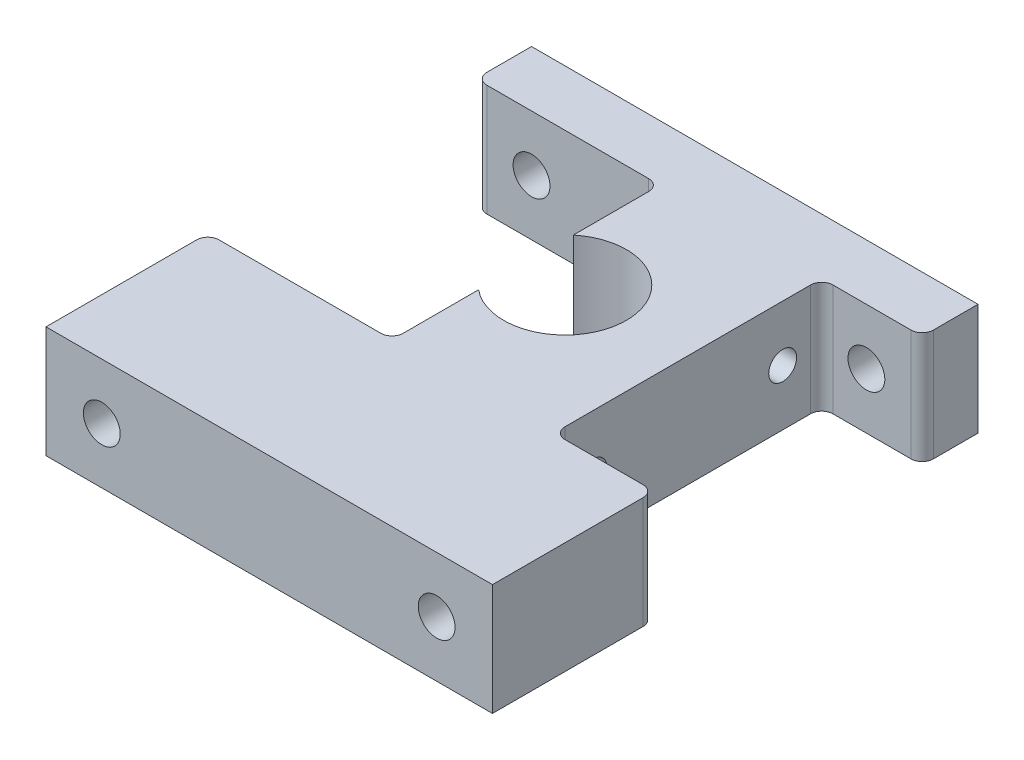
ISO-10303-21;
HEADER;
FILE_DESCRIPTION(('STEP AP214'),'2;1');
FILE_NAME('part.step','',(''),(''),'','','');
FILE_SCHEMA(('AUTOMOTIVE_DESIGN { 1 0 10303 214 1 1 1 1 }'));
ENDSEC;
DATA;
#1=APPLICATION_CONTEXT('core data for automotive mechanical design processes');
#2=APPLICATION_PROTOCOL_DEFINITION('international standard','automotive_design',2000,#1);
#3=PRODUCT_CONTEXT('',#1,'mechanical');
#4=PRODUCT('Part','Part','',(#3));
#5=PRODUCT_RELATED_PRODUCT_CATEGORY('part','',(#4));
#6=PRODUCT_DEFINITION_FORMATION('','',#4);
#7=PRODUCT_DEFINITION_CONTEXT('part definition',#1,'design');
#8=PRODUCT_DEFINITION('design','',#6,#7);
#9=PRODUCT_DEFINITION_SHAPE('','',#8);
#10=(LENGTH_UNIT() NAMED_UNIT(*) SI_UNIT(.MILLI.,.METRE.));
#11=(NAMED_UNIT(*) PLANE_ANGLE_UNIT() SI_UNIT($,.RADIAN.));
#12=(NAMED_UNIT(*) SI_UNIT($,.STERADIAN.) SOLID_ANGLE_UNIT());
#13=UNCERTAINTY_MEASURE_WITH_UNIT(LENGTH_MEASURE(1.E-05),#10,'distance_accuracy_value','');
#14=(GEOMETRIC_REPRESENTATION_CONTEXT(3) GLOBAL_UNCERTAINTY_ASSIGNED_CONTEXT((#13)) GLOBAL_UNIT_ASSIGNED_CONTEXT((#10,
#11,#12)) REPRESENTATION_CONTEXT('',''));
#15=CARTESIAN_POINT('',(0.,0.,0.));
#16=DIRECTION('',(0.,0.,1.));
#17=DIRECTION('',(1.,0.,0.));
#18=AXIS2_PLACEMENT_3D('',#15,#16,#17);
#19=CARTESIAN_POINT('',(20.,10.,17.));
#20=DIRECTION('',(-1.,0.,0.));
#21=DIRECTION('',(0.,0.,1.));
#22=AXIS2_PLACEMENT_3D('',#19,#20,#21);
#23=PLANE('',#22);
#24=DIRECTION('',(0.,0.,-1.));
#25=VECTOR('',#24,1.);
#26=CARTESIAN_POINT('',(20.,10.,17.));
#27=LINE('',#26,#25);
#28=CARTESIAN_POINT('',(20.,10.,-12.9999999999999));
#29=VERTEX_POINT('',#28);
#30=CARTESIAN_POINT('',(20.,10.,-17.));
#31=VERTEX_POINT('',#30);
#32=EDGE_CURVE('E209',#29,#31,#27,.T.);
#33=ORIENTED_EDGE('',*,*,#32,.F.);
#34=DIRECTION('',(0.,-1.,0.));
#35=VECTOR('',#34,1.);
#36=CARTESIAN_POINT('',(20.,10.,-12.9999999999999));
#37=LINE('',#36,#35);
#38=CARTESIAN_POINT('',(20.,0.,-12.9999999999999));
#39=VERTEX_POINT('',#38);
#40=EDGE_CURVE('E57',#29,#39,#37,.T.);
#41=ORIENTED_EDGE('',*,*,#40,.T.);
#42=DIRECTION('',(0.,0.,-1.));
#43=VECTOR('',#42,1.);
#44=CARTESIAN_POINT('',(20.,0.,17.));
#45=LINE('',#44,#43);
#46=CARTESIAN_POINT('',(20.,0.,-17.));
#47=VERTEX_POINT('',#46);
#48=EDGE_CURVE('E358',#39,#47,#45,.T.);
#49=ORIENTED_EDGE('',*,*,#48,.T.);
#50=DIRECTION('',(0.,-1.,0.));
#51=VECTOR('',#50,1.);
#52=CARTESIAN_POINT('',(20.,10.,-17.));
#53=LINE('',#52,#51);
#54=EDGE_CURVE('E382',#31,#47,#53,.T.);
#55=ORIENTED_EDGE('',*,*,#54,.F.);
#56=EDGE_LOOP('',(#33,#41,#49,#55));
#57=FACE_BOUND('',#56,.T.);
#58=ADVANCED_FACE('F47',(#57),#23,.F.);
#59=CARTESIAN_POINT('',(-20.,10.,17.));
#60=DIRECTION('',(1.,0.,0.));
#61=DIRECTION('',(0.,0.,-1.));
#62=AXIS2_PLACEMENT_3D('',#59,#60,#61);
#63=PLANE('',#62);
#64=DIRECTION('',(0.,0.,1.));
#65=VECTOR('',#64,1.);
#66=CARTESIAN_POINT('',(-20.,10.,17.));
#67=LINE('',#66,#65);
#68=CARTESIAN_POINT('',(-20.,10.,13.));
#69=VERTEX_POINT('',#68);
#70=CARTESIAN_POINT('',(-20.,10.,26.5));
#71=VERTEX_POINT('',#70);
#72=EDGE_CURVE('E224',#69,#71,#67,.T.);
#73=ORIENTED_EDGE('',*,*,#72,.F.);
#74=DIRECTION('',(0.,-1.,0.));
#75=VECTOR('',#74,1.);
#76=CARTESIAN_POINT('',(-20.,10.,13.));
#77=LINE('',#76,#75);
#78=CARTESIAN_POINT('',(-20.,0.,13.));
#79=VERTEX_POINT('',#78);
#80=EDGE_CURVE('E392',#69,#79,#77,.T.);
#81=ORIENTED_EDGE('',*,*,#80,.T.);
#82=DIRECTION('',(0.,0.,1.));
#83=VECTOR('',#82,1.);
#84=CARTESIAN_POINT('',(-20.,0.,17.));
#85=LINE('',#84,#83);
#86=CARTESIAN_POINT('',(-20.,0.,26.5));
#87=VERTEX_POINT('',#86);
#88=EDGE_CURVE('E374',#79,#87,#85,.T.);
#89=ORIENTED_EDGE('',*,*,#88,.T.);
#90=DIRECTION('',(0.,-1.,0.));
#91=VECTOR('',#90,1.);
#92=CARTESIAN_POINT('',(-20.,10.,26.5));
#93=LINE('',#92,#91);
#94=EDGE_CURVE('E219',#71,#87,#93,.T.);
#95=ORIENTED_EDGE('',*,*,#94,.F.);
#96=EDGE_LOOP('',(#73,#81,#89,#95));
#97=FACE_BOUND('',#96,.T.);
#98=ADVANCED_FACE('F615',(#97),#63,.F.);
#99=CARTESIAN_POINT('',(0.,10.,0.));
#100=DIRECTION('',(0.,-1.,0.));
#101=DIRECTION('',(0.,0.,-1.));
#102=AXIS2_PLACEMENT_3D('',#99,#100,#101);
#103=PLANE('',#102);
#104=DIRECTION('',(-1.,0.,0.));
#105=VECTOR('',#104,1.);
#106=CARTESIAN_POINT('',(-36.5,10.,12.));
#107=LINE('',#106,#105);
#108=CARTESIAN_POINT('',(-4.5,10.,12.));
#109=VERTEX_POINT('',#108);
#110=CARTESIAN_POINT('',(-19.,10.,12.));
#111=VERTEX_POINT('',#110);
#112=EDGE_CURVE('E268',#109,#111,#107,.T.);
#113=ORIENTED_EDGE('',*,*,#112,.T.);
#114=CARTESIAN_POINT('',(-19.,10.,13.));
#115=DIRECTION('',(0.,-1.,0.));
#116=DIRECTION('',(0.,0.,-1.));
#117=AXIS2_PLACEMENT_3D('',#114,#115,#116);
#118=CIRCLE('',#117,1.);
#119=EDGE_CURVE('E419',#111,#69,#118,.F.);
#120=ORIENTED_EDGE('',*,*,#119,.T.);
#121=ORIENTED_EDGE('',*,*,#72,.T.);
#122=DIRECTION('',(-1.,0.,0.));
#123=VECTOR('',#122,1.);
#124=CARTESIAN_POINT('',(-20.,10.,26.5));
#125=LINE('',#124,#123);
#126=CARTESIAN_POINT('',(20.,10.,26.5));
#127=VERTEX_POINT('',#126);
#128=EDGE_CURVE('E215',#127,#71,#125,.T.);
#129=ORIENTED_EDGE('',*,*,#128,.F.);
#130=CARTESIAN_POINT('',(20.,10.,13.));
#131=VERTEX_POINT('',#130);
#132=EDGE_CURVE('E198',#127,#131,#27,.T.);
#133=ORIENTED_EDGE('',*,*,#132,.T.);
#134=CARTESIAN_POINT('',(19.,10.,13.));
#135=DIRECTION('',(0.,-1.,0.));
#136=DIRECTION('',(0.,0.,-1.));
#137=AXIS2_PLACEMENT_3D('',#134,#135,#136);
#138=CIRCLE('',#137,1.);
#139=CARTESIAN_POINT('',(19.,10.,12.));
#140=VERTEX_POINT('',#139);
#141=EDGE_CURVE('E414',#131,#140,#138,.F.);
#142=ORIENTED_EDGE('',*,*,#141,.T.);
#143=DIRECTION('',(-1.,0.,0.));
#144=VECTOR('',#143,1.);
#145=CARTESIAN_POINT('',(12.,10.,12.));
#146=LINE('',#145,#144);
#147=CARTESIAN_POINT('',(12.,10.,12.));
#148=VERTEX_POINT('',#147);
#149=EDGE_CURVE('E305',#140,#148,#146,.T.);
#150=ORIENTED_EDGE('',*,*,#149,.T.);
#151=CARTESIAN_POINT('',(12.,10.,11.));
#152=DIRECTION('',(0.,-1.,0.));
#153=DIRECTION('',(0.,0.,1.));
#154=AXIS2_PLACEMENT_3D('',#151,#152,#153);
#155=CIRCLE('',#154,1.);
#156=CARTESIAN_POINT('',(11.,10.,11.));
#157=VERTEX_POINT('',#156);
#158=EDGE_CURVE('E308',#148,#157,#155,.T.);
#159=ORIENTED_EDGE('',*,*,#158,.T.);
#160=DIRECTION('',(0.,0.,-1.));
#161=VECTOR('',#160,1.);
#162=CARTESIAN_POINT('',(11.,10.,-10.9999999999999));
#163=LINE('',#162,#161);
#164=CARTESIAN_POINT('',(11.,10.,-10.9999999999999));
#165=VERTEX_POINT('',#164);
#166=EDGE_CURVE('E313',#157,#165,#163,.T.);
#167=ORIENTED_EDGE('',*,*,#166,.T.);
#168=CARTESIAN_POINT('',(12.,10.,-10.9999999999999));
#169=DIRECTION('',(0.,-1.,0.));
#170=DIRECTION('',(0.,0.,1.));
#171=AXIS2_PLACEMENT_3D('',#168,#169,#170);
#172=CIRCLE('',#171,0.999999999999999);
#173=CARTESIAN_POINT('',(12.,10.,-11.9999999999999));
#174=VERTEX_POINT('',#173);
#175=EDGE_CURVE('E317',#165,#174,#172,.T.);
#176=ORIENTED_EDGE('',*,*,#175,.T.);
#177=DIRECTION('',(1.,0.,0.));
#178=VECTOR('',#177,1.);
#179=CARTESIAN_POINT('',(12.,10.,-11.9999999999999));
#180=LINE('',#179,#178);
#181=CARTESIAN_POINT('',(19.,10.,-11.9999999999999));
#182=VERTEX_POINT('',#181);
#183=EDGE_CURVE('E321',#174,#182,#180,.T.);
#184=ORIENTED_EDGE('',*,*,#183,.T.);
#185=CARTESIAN_POINT('',(19.,10.,-12.9999999999999));
#186=DIRECTION('',(0.,-1.,0.));
#187=DIRECTION('',(0.,0.,-1.));
#188=AXIS2_PLACEMENT_3D('',#185,#186,#187);
#189=CIRCLE('',#188,1.);
#190=EDGE_CURVE('E411',#182,#29,#189,.F.);
#191=ORIENTED_EDGE('',*,*,#190,.T.);
#192=ORIENTED_EDGE('',*,*,#32,.T.);
#193=DIRECTION('',(-1.,0.,0.));
#194=VECTOR('',#193,1.);
#195=CARTESIAN_POINT('',(-20.,10.,-17.));
#196=LINE('',#195,#194);
#197=CARTESIAN_POINT('',(-20.,10.,-17.));
#198=VERTEX_POINT('',#197);
#199=EDGE_CURVE('E208',#31,#198,#196,.T.);
#200=ORIENTED_EDGE('',*,*,#199,.T.);
#201=CARTESIAN_POINT('',(-20.,10.,-13.));
#202=VERTEX_POINT('',#201);
#203=EDGE_CURVE('E364',#198,#202,#67,.T.);
#204=ORIENTED_EDGE('',*,*,#203,.T.);
#205=CARTESIAN_POINT('',(-19.,10.,-13.));
#206=DIRECTION('',(0.,-1.,0.));
#207=DIRECTION('',(0.,0.,-1.));
#208=AXIS2_PLACEMENT_3D('',#205,#206,#207);
#209=CIRCLE('',#208,1.);
#210=CARTESIAN_POINT('',(-19.,10.,-12.));
#211=VERTEX_POINT('',#210);
#212=EDGE_CURVE('E64',#202,#211,#209,.F.);
#213=ORIENTED_EDGE('',*,*,#212,.T.);
#214=DIRECTION('',(1.,0.,0.));
#215=VECTOR('',#214,1.);
#216=CARTESIAN_POINT('',(-36.5,10.,-12.));
#217=LINE('',#216,#215);
#218=CARTESIAN_POINT('',(-4.5,10.,-12.));
#219=VERTEX_POINT('',#218);
#220=EDGE_CURVE('E251',#211,#219,#217,.T.);
#221=ORIENTED_EDGE('',*,*,#220,.T.);
#222=CARTESIAN_POINT('',(-4.5,10.,-11.));
#223=DIRECTION('',(0.,-1.,0.));
#224=DIRECTION('',(0.,0.,-1.));
#225=AXIS2_PLACEMENT_3D('',#222,#223,#224);
#226=CIRCLE('',#225,1.);
#227=CARTESIAN_POINT('',(-3.5,10.,-11.));
#228=VERTEX_POINT('',#227);
#229=EDGE_CURVE('E254',#219,#228,#226,.T.);
#230=ORIENTED_EDGE('',*,*,#229,.T.);
#231=DIRECTION('',(0.,0.,1.));
#232=VECTOR('',#231,1.);
#233=CARTESIAN_POINT('',(-3.5,10.,-11.));
#234=LINE('',#233,#232);
#235=CARTESIAN_POINT('',(-3.5,10.,-4.24264068711928));
#236=VERTEX_POINT('',#235);
#237=EDGE_CURVE('E260',#228,#236,#234,.T.);
#238=ORIENTED_EDGE('',*,*,#237,.T.);
#239=CARTESIAN_POINT('',(0.,10.,0.));
#240=DIRECTION('',(0.,1.,0.));
#241=DIRECTION('',(0.,0.,1.));
#242=AXIS2_PLACEMENT_3D('',#239,#240,#241);
#243=CIRCLE('',#242,5.5);
#244=CARTESIAN_POINT('',(-3.5,10.,4.24264068711928));
#245=VERTEX_POINT('',#244);
#246=EDGE_CURVE('E354',#245,#236,#243,.T.);
#247=ORIENTED_EDGE('',*,*,#246,.F.);
#248=CARTESIAN_POINT('',(-3.5,10.,11.));
#249=VERTEX_POINT('',#248);
#250=EDGE_CURVE('E259',#245,#249,#234,.T.);
#251=ORIENTED_EDGE('',*,*,#250,.T.);
#252=CARTESIAN_POINT('',(-4.5,10.,11.));
#253=DIRECTION('',(0.,-1.,0.));
#254=DIRECTION('',(0.,0.,1.));
#255=AXIS2_PLACEMENT_3D('',#252,#253,#254);
#256=CIRCLE('',#255,1.);
#257=EDGE_CURVE('E264',#249,#109,#256,.T.);
#258=ORIENTED_EDGE('',*,*,#257,.T.);
#259=EDGE_LOOP('',(#113,#120,#121,#129,#133,#142,#150,#159,#167,#176,#184,#191,#192,#200,#204,
#213,#221,#230,#238,#247,#251,#258));
#260=FACE_BOUND('',#259,.T.);
#261=ADVANCED_FACE('F222',(#260),#103,.F.);
#262=CARTESIAN_POINT('',(0.,0.,0.));
#263=DIRECTION('',(0.,-1.,0.));
#264=DIRECTION('',(0.,0.,-1.));
#265=AXIS2_PLACEMENT_3D('',#262,#263,#264);
#266=PLANE('',#265);
#267=ORIENTED_EDGE('',*,*,#88,.F.);
#268=CARTESIAN_POINT('',(-19.,0.,13.));
#269=DIRECTION('',(0.,-1.,0.));
#270=DIRECTION('',(0.,0.,-1.));
#271=AXIS2_PLACEMENT_3D('',#268,#269,#270);
#272=CIRCLE('',#271,1.);
#273=CARTESIAN_POINT('',(-19.,0.,12.));
#274=VERTEX_POINT('',#273);
#275=EDGE_CURVE('E405',#79,#274,#272,.T.);
#276=ORIENTED_EDGE('',*,*,#275,.T.);
#277=DIRECTION('',(-1.,0.,0.));
#278=VECTOR('',#277,1.);
#279=CARTESIAN_POINT('',(-36.5,0.,12.));
#280=LINE('',#279,#278);
#281=CARTESIAN_POINT('',(-4.5,0.,12.));
#282=VERTEX_POINT('',#281);
#283=EDGE_CURVE('E255',#282,#274,#280,.T.);
#284=ORIENTED_EDGE('',*,*,#283,.F.);
#285=CARTESIAN_POINT('',(-4.5,0.,11.));
#286=DIRECTION('',(0.,-1.,0.));
#287=DIRECTION('',(0.,0.,1.));
#288=AXIS2_PLACEMENT_3D('',#285,#286,#287);
#289=CIRCLE('',#288,1.);
#290=CARTESIAN_POINT('',(-3.5,0.,11.));
#291=VERTEX_POINT('',#290);
#292=EDGE_CURVE('E284',#291,#282,#289,.T.);
#293=ORIENTED_EDGE('',*,*,#292,.F.);
#294=DIRECTION('',(0.,0.,1.));
#295=VECTOR('',#294,1.);
#296=CARTESIAN_POINT('',(-3.5,0.,-11.));
#297=LINE('',#296,#295);
#298=CARTESIAN_POINT('',(-3.5,0.,4.24264068711928));
#299=VERTEX_POINT('',#298);
#300=EDGE_CURVE('E280',#299,#291,#297,.T.);
#301=ORIENTED_EDGE('',*,*,#300,.F.);
#302=CARTESIAN_POINT('',(0.,0.,0.));
#303=DIRECTION('',(0.,1.,0.));
#304=DIRECTION('',(0.,0.,1.));
#305=AXIS2_PLACEMENT_3D('',#302,#303,#304);
#306=CIRCLE('',#305,5.5);
#307=CARTESIAN_POINT('',(-3.5,0.,-4.24264068711928));
#308=VERTEX_POINT('',#307);
#309=EDGE_CURVE('E294',#299,#308,#306,.T.);
#310=ORIENTED_EDGE('',*,*,#309,.T.);
#311=CARTESIAN_POINT('',(-3.5,0.,-11.));
#312=VERTEX_POINT('',#311);
#313=EDGE_CURVE('E281',#312,#308,#297,.T.);
#314=ORIENTED_EDGE('',*,*,#313,.F.);
#315=CARTESIAN_POINT('',(-4.5,0.,-11.));
#316=DIRECTION('',(0.,-1.,0.));
#317=DIRECTION('',(0.,0.,-1.));
#318=AXIS2_PLACEMENT_3D('',#315,#316,#317);
#319=CIRCLE('',#318,1.);
#320=CARTESIAN_POINT('',(-4.5,0.,-12.));
#321=VERTEX_POINT('',#320);
#322=EDGE_CURVE('E275',#321,#312,#319,.T.);
#323=ORIENTED_EDGE('',*,*,#322,.F.);
#324=DIRECTION('',(1.,0.,0.));
#325=VECTOR('',#324,1.);
#326=CARTESIAN_POINT('',(-36.5,0.,-12.));
#327=LINE('',#326,#325);
#328=CARTESIAN_POINT('',(-19.,0.,-12.));
#329=VERTEX_POINT('',#328);
#330=EDGE_CURVE('E272',#329,#321,#327,.T.);
#331=ORIENTED_EDGE('',*,*,#330,.F.);
#332=CARTESIAN_POINT('',(-19.,0.,-13.));
#333=DIRECTION('',(0.,-1.,0.));
#334=DIRECTION('',(0.,0.,-1.));
#335=AXIS2_PLACEMENT_3D('',#332,#333,#334);
#336=CIRCLE('',#335,1.);
#337=CARTESIAN_POINT('',(-20.,0.,-13.));
#338=VERTEX_POINT('',#337);
#339=EDGE_CURVE('E402',#329,#338,#336,.T.);
#340=ORIENTED_EDGE('',*,*,#339,.T.);
#341=CARTESIAN_POINT('',(-20.,0.,-17.));
#342=VERTEX_POINT('',#341);
#343=EDGE_CURVE('E375',#342,#338,#85,.T.);
#344=ORIENTED_EDGE('',*,*,#343,.F.);
#345=DIRECTION('',(-1.,0.,0.));
#346=VECTOR('',#345,1.);
#347=CARTESIAN_POINT('',(-20.,0.,-17.));
#348=LINE('',#347,#346);
#349=EDGE_CURVE('E371',#47,#342,#348,.T.);
#350=ORIENTED_EDGE('',*,*,#349,.F.);
#351=ORIENTED_EDGE('',*,*,#48,.F.);
#352=CARTESIAN_POINT('',(19.,0.,-12.9999999999999));
#353=DIRECTION('',(0.,-1.,0.));
#354=DIRECTION('',(0.,0.,-1.));
#355=AXIS2_PLACEMENT_3D('',#352,#353,#354);
#356=CIRCLE('',#355,1.);
#357=CARTESIAN_POINT('',(19.,0.,-11.9999999999999));
#358=VERTEX_POINT('',#357);
#359=EDGE_CURVE('E396',#39,#358,#356,.T.);
#360=ORIENTED_EDGE('',*,*,#359,.T.);
#361=DIRECTION('',(1.,0.,0.));
#362=VECTOR('',#361,1.);
#363=CARTESIAN_POINT('',(12.,0.,-11.9999999999999));
#364=LINE('',#363,#362);
#365=CARTESIAN_POINT('',(12.,0.,-11.9999999999999));
#366=VERTEX_POINT('',#365);
#367=EDGE_CURVE('E309',#366,#358,#364,.T.);
#368=ORIENTED_EDGE('',*,*,#367,.F.);
#369=CARTESIAN_POINT('',(12.,0.,-10.9999999999999));
#370=DIRECTION('',(0.,-1.,0.));
#371=DIRECTION('',(0.,0.,1.));
#372=AXIS2_PLACEMENT_3D('',#369,#370,#371);
#373=CIRCLE('',#372,0.999999999999999);
#374=CARTESIAN_POINT('',(11.,0.,-10.9999999999999));
#375=VERTEX_POINT('',#374);
#376=EDGE_CURVE('E336',#375,#366,#373,.T.);
#377=ORIENTED_EDGE('',*,*,#376,.F.);
#378=DIRECTION('',(0.,0.,-1.));
#379=VECTOR('',#378,1.);
#380=CARTESIAN_POINT('',(11.,0.,-10.9999999999999));
#381=LINE('',#380,#379);
#382=CARTESIAN_POINT('',(11.,0.,11.));
#383=VERTEX_POINT('',#382);
#384=EDGE_CURVE('E332',#383,#375,#381,.T.);
#385=ORIENTED_EDGE('',*,*,#384,.F.);
#386=CARTESIAN_POINT('',(12.,0.,11.));
#387=DIRECTION('',(0.,-1.,0.));
#388=DIRECTION('',(0.,0.,1.));
#389=AXIS2_PLACEMENT_3D('',#386,#387,#388);
#390=CIRCLE('',#389,1.);
#391=CARTESIAN_POINT('',(12.,0.,12.));
#392=VERTEX_POINT('',#391);
#393=EDGE_CURVE('E328',#392,#383,#390,.T.);
#394=ORIENTED_EDGE('',*,*,#393,.F.);
#395=DIRECTION('',(-1.,0.,0.));
#396=VECTOR('',#395,1.);
#397=CARTESIAN_POINT('',(12.,0.,12.));
#398=LINE('',#397,#396);
#399=CARTESIAN_POINT('',(19.,0.,12.));
#400=VERTEX_POINT('',#399);
#401=EDGE_CURVE('E250',#400,#392,#398,.T.);
#402=ORIENTED_EDGE('',*,*,#401,.F.);
#403=CARTESIAN_POINT('',(19.,0.,13.));
#404=DIRECTION('',(0.,-1.,0.));
#405=DIRECTION('',(0.,0.,-1.));
#406=AXIS2_PLACEMENT_3D('',#403,#404,#405);
#407=CIRCLE('',#406,1.);
#408=CARTESIAN_POINT('',(20.,0.,13.));
#409=VERTEX_POINT('',#408);
#410=EDGE_CURVE('E399',#400,#409,#407,.T.);
#411=ORIENTED_EDGE('',*,*,#410,.T.);
#412=CARTESIAN_POINT('',(20.,0.,26.5));
#413=VERTEX_POINT('',#412);
#414=EDGE_CURVE('E368',#413,#409,#45,.T.);
#415=ORIENTED_EDGE('',*,*,#414,.F.);
#416=DIRECTION('',(-1.,0.,0.));
#417=VECTOR('',#416,1.);
#418=CARTESIAN_POINT('',(-20.,0.,26.5));
#419=LINE('',#418,#417);
#420=EDGE_CURVE('E217',#413,#87,#419,.T.);
#421=ORIENTED_EDGE('',*,*,#420,.T.);
#422=EDGE_LOOP('',(#267,#276,#284,#293,#301,#310,#314,#323,#331,#340,#344,#350,#351,#360,#368,
#377,#385,#394,#402,#411,#415,#421));
#423=FACE_BOUND('',#422,.T.);
#424=ADVANCED_FACE('F447',(#423),#266,.T.);
#425=ORIENTED_EDGE('',*,*,#414,.T.);
#426=DIRECTION('',(0.,1.,0.));
#427=VECTOR('',#426,1.);
#428=CARTESIAN_POINT('',(20.,10.,13.));
#429=LINE('',#428,#427);
#430=EDGE_CURVE('E205',#409,#131,#429,.T.);
#431=ORIENTED_EDGE('',*,*,#430,.T.);
#432=ORIENTED_EDGE('',*,*,#132,.F.);
#433=DIRECTION('',(0.,-1.,0.));
#434=VECTOR('',#433,1.);
#435=CARTESIAN_POINT('',(20.,10.,26.5));
#436=LINE('',#435,#434);
#437=EDGE_CURVE('E202',#127,#413,#436,.T.);
#438=ORIENTED_EDGE('',*,*,#437,.T.);
#439=EDGE_LOOP('',(#425,#431,#432,#438));
#440=FACE_BOUND('',#439,.T.);
#441=ADVANCED_FACE('F201',(#440),#23,.F.);
#442=CARTESIAN_POINT('',(-20.,10.,-17.));
#443=DIRECTION('',(0.,0.,1.));
#444=DIRECTION('',(1.,0.,0.));
#445=AXIS2_PLACEMENT_3D('',#442,#443,#444);
#446=PLANE('',#445);
#447=CARTESIAN_POINT('',(15.,5.,-17.));
#448=DIRECTION('',(0.,0.,-1.));
#449=DIRECTION('',(-1.,0.,0.));
#450=AXIS2_PLACEMENT_3D('',#447,#448,#449);
#451=CIRCLE('',#450,1.64999999999999);
#452=CARTESIAN_POINT('',(13.35,5.,-17.));
#453=VERTEX_POINT('',#452);
#454=EDGE_CURVE('E576',#453,#453,#451,.T.);
#455=ORIENTED_EDGE('',*,*,#454,.F.);
#456=EDGE_LOOP('',(#455));
#457=FACE_BOUND('',#456,.T.);
#458=CARTESIAN_POINT('',(-15.,5.,-17.));
#459=DIRECTION('',(0.,0.,-1.));
#460=DIRECTION('',(-1.,0.,0.));
#461=AXIS2_PLACEMENT_3D('',#458,#459,#460);
#462=CIRCLE('',#461,1.64999999999999);
#463=CARTESIAN_POINT('',(-16.65,5.,-17.));
#464=VERTEX_POINT('',#463);
#465=EDGE_CURVE('E564',#464,#464,#462,.T.);
#466=ORIENTED_EDGE('',*,*,#465,.F.);
#467=EDGE_LOOP('',(#466));
#468=FACE_BOUND('',#467,.T.);
#469=ORIENTED_EDGE('',*,*,#349,.T.);
#470=DIRECTION('',(0.,-1.,0.));
#471=VECTOR('',#470,1.);
#472=CARTESIAN_POINT('',(-20.,10.,-17.));
#473=LINE('',#472,#471);
#474=EDGE_CURVE('E367',#198,#342,#473,.T.);
#475=ORIENTED_EDGE('',*,*,#474,.F.);
#476=ORIENTED_EDGE('',*,*,#199,.F.);
#477=ORIENTED_EDGE('',*,*,#54,.T.);
#478=EDGE_LOOP('',(#469,#475,#476,#477));
#479=FACE_BOUND('',#478,.T.);
#480=ADVANCED_FACE('F587',(#457,#468,#479),#446,.F.);
#481=ORIENTED_EDGE('',*,*,#343,.T.);
#482=DIRECTION('',(0.,1.,0.));
#483=VECTOR('',#482,1.);
#484=CARTESIAN_POINT('',(-20.,10.,-13.));
#485=LINE('',#484,#483);
#486=EDGE_CURVE('E422',#338,#202,#485,.T.);
#487=ORIENTED_EDGE('',*,*,#486,.T.);
#488=ORIENTED_EDGE('',*,*,#203,.F.);
#489=ORIENTED_EDGE('',*,*,#474,.T.);
#490=EDGE_LOOP('',(#481,#487,#488,#489));
#491=FACE_BOUND('',#490,.T.);
#492=ADVANCED_FACE('F590',(#491),#63,.F.);
#493=CARTESIAN_POINT('',(0.,10.,0.));
#494=DIRECTION('',(0.,-1.,0.));
#495=DIRECTION('',(0.,0.,-1.));
#496=AXIS2_PLACEMENT_3D('',#493,#494,#495);
#497=CYLINDRICAL_SURFACE('',#496,5.5);
#498=DIRECTION('',(0.,-1.,0.));
#499=VECTOR('',#498,1.);
#500=CARTESIAN_POINT('',(-3.5,10.,4.24264068711928));
#501=LINE('',#500,#499);
#502=EDGE_CURVE('E389',#245,#299,#501,.T.);
#503=ORIENTED_EDGE('',*,*,#502,.F.);
#504=ORIENTED_EDGE('',*,*,#246,.T.);
#505=DIRECTION('',(0.,-1.,0.));
#506=VECTOR('',#505,1.);
#507=CARTESIAN_POINT('',(-3.5,10.,-4.24264068711928));
#508=LINE('',#507,#506);
#509=EDGE_CURVE('E386',#308,#236,#508,.F.);
#510=ORIENTED_EDGE('',*,*,#509,.F.);
#511=ORIENTED_EDGE('',*,*,#309,.F.);
#512=EDGE_LOOP('',(#503,#504,#510,#511));
#513=FACE_BOUND('',#512,.T.);
#514=ADVANCED_FACE('F669',(#513),#497,.F.);
#515=CARTESIAN_POINT('',(-3.5,10.,-11.));
#516=DIRECTION('',(1.,0.,0.));
#517=DIRECTION('',(0.,0.,-1.));
#518=AXIS2_PLACEMENT_3D('',#515,#516,#517);
#519=PLANE('',#518);
#520=CARTESIAN_POINT('',(-3.5,5.,-8.5));
#521=DIRECTION('',(-1.,0.,0.));
#522=DIRECTION('',(0.,0.,1.));
#523=AXIS2_PLACEMENT_3D('',#520,#521,#522);
#524=CIRCLE('',#523,1.24999999999999);
#525=CARTESIAN_POINT('',(-3.5,5.,-7.25000000000002));
#526=VERTEX_POINT('',#525);
#527=EDGE_CURVE('E237',#526,#526,#524,.T.);
#528=ORIENTED_EDGE('',*,*,#527,.F.);
#529=EDGE_LOOP('',(#528));
#530=FACE_BOUND('',#529,.T.);
#531=ORIENTED_EDGE('',*,*,#509,.T.);
#532=ORIENTED_EDGE('',*,*,#237,.F.);
#533=DIRECTION('',(0.,-1.,0.));
#534=VECTOR('',#533,1.);
#535=CARTESIAN_POINT('',(-3.5,10.,-11.));
#536=LINE('',#535,#534);
#537=EDGE_CURVE('E299',#228,#312,#536,.T.);
#538=ORIENTED_EDGE('',*,*,#537,.T.);
#539=ORIENTED_EDGE('',*,*,#313,.T.);
#540=EDGE_LOOP('',(#531,#532,#538,#539));
#541=FACE_BOUND('',#540,.T.);
#542=ADVANCED_FACE('F673',(#530,#541),#519,.F.);
#543=CARTESIAN_POINT('',(-36.5,10.,-12.));
#544=DIRECTION('',(0.,0.,-1.));
#545=DIRECTION('',(-1.,0.,0.));
#546=AXIS2_PLACEMENT_3D('',#543,#544,#545);
#547=PLANE('',#546);
#548=CARTESIAN_POINT('',(-15.,5.,-12.));
#549=DIRECTION('',(0.,0.,-1.));
#550=DIRECTION('',(-1.,0.,0.));
#551=AXIS2_PLACEMENT_3D('',#548,#549,#550);
#552=CIRCLE('',#551,1.64999999999999);
#553=CARTESIAN_POINT('',(-16.65,5.,-12.));
#554=VERTEX_POINT('',#553);
#555=EDGE_CURVE('E558',#554,#554,#552,.T.);
#556=ORIENTED_EDGE('',*,*,#555,.T.);
#557=EDGE_LOOP('',(#556));
#558=FACE_BOUND('',#557,.T.);
#559=ORIENTED_EDGE('',*,*,#220,.F.);
#560=DIRECTION('',(0.,1.,0.));
#561=VECTOR('',#560,1.);
#562=CARTESIAN_POINT('',(-19.,10.,-12.));
#563=LINE('',#562,#561);
#564=EDGE_CURVE('E425',#211,#329,#563,.F.);
#565=ORIENTED_EDGE('',*,*,#564,.T.);
#566=ORIENTED_EDGE('',*,*,#330,.T.);
#567=DIRECTION('',(0.,-1.,0.));
#568=VECTOR('',#567,1.);
#569=CARTESIAN_POINT('',(-4.5,10.,-12.));
#570=LINE('',#569,#568);
#571=EDGE_CURVE('E271',#219,#321,#570,.T.);
#572=ORIENTED_EDGE('',*,*,#571,.F.);
#573=EDGE_LOOP('',(#559,#565,#566,#572));
#574=FACE_BOUND('',#573,.T.);
#575=ADVANCED_FACE('F678',(#558,#574),#547,.F.);
#576=CARTESIAN_POINT('',(-4.5,10.,-11.));
#577=DIRECTION('',(0.,-1.,0.));
#578=DIRECTION('',(0.,0.,-1.));
#579=AXIS2_PLACEMENT_3D('',#576,#577,#578);
#580=CYLINDRICAL_SURFACE('',#579,1.);
#581=ORIENTED_EDGE('',*,*,#322,.T.);
#582=ORIENTED_EDGE('',*,*,#537,.F.);
#583=ORIENTED_EDGE('',*,*,#229,.F.);
#584=ORIENTED_EDGE('',*,*,#571,.T.);
#585=EDGE_LOOP('',(#581,#582,#583,#584));
#586=FACE_BOUND('',#585,.T.);
#587=ADVANCED_FACE('F701',(#586),#580,.F.);
#588=CARTESIAN_POINT('',(-36.5,10.,12.));
#589=DIRECTION('',(0.,0.,1.));
#590=DIRECTION('',(1.,0.,0.));
#591=AXIS2_PLACEMENT_3D('',#588,#589,#590);
#592=PLANE('',#591);
#593=CARTESIAN_POINT('',(-15.,5.,12.));
#594=DIRECTION('',(0.,0.,1.));
#595=DIRECTION('',(1.,0.,0.));
#596=AXIS2_PLACEMENT_3D('',#593,#594,#595);
#597=CIRCLE('',#596,1.64999999999999);
#598=CARTESIAN_POINT('',(-13.35,5.,12.));
#599=VERTEX_POINT('',#598);
#600=EDGE_CURVE('E547',#599,#599,#597,.T.);
#601=ORIENTED_EDGE('',*,*,#600,.T.);
#602=EDGE_LOOP('',(#601));
#603=FACE_BOUND('',#602,.T.);
#604=ORIENTED_EDGE('',*,*,#283,.T.);
#605=DIRECTION('',(0.,-1.,0.));
#606=VECTOR('',#605,1.);
#607=CARTESIAN_POINT('',(-19.,10.,12.));
#608=LINE('',#607,#606);
#609=EDGE_CURVE('E408',#274,#111,#608,.F.);
#610=ORIENTED_EDGE('',*,*,#609,.T.);
#611=ORIENTED_EDGE('',*,*,#112,.F.);
#612=DIRECTION('',(0.,-1.,0.));
#613=VECTOR('',#612,1.);
#614=CARTESIAN_POINT('',(-4.5,10.,12.));
#615=LINE('',#614,#613);
#616=EDGE_CURVE('E291',#109,#282,#615,.T.);
#617=ORIENTED_EDGE('',*,*,#616,.T.);
#618=EDGE_LOOP('',(#604,#610,#611,#617));
#619=FACE_BOUND('',#618,.T.);
#620=ADVANCED_FACE('F704',(#603,#619),#592,.F.);
#621=CARTESIAN_POINT('',(-3.5,5.,8.5));
#622=DIRECTION('',(-1.,0.,0.));
#623=DIRECTION('',(0.,0.,1.));
#624=AXIS2_PLACEMENT_3D('',#621,#622,#623);
#625=CIRCLE('',#624,1.24999999999999);
#626=CARTESIAN_POINT('',(-3.5,5.,9.74999999999999));
#627=VERTEX_POINT('',#626);
#628=EDGE_CURVE('E242',#627,#627,#625,.T.);
#629=ORIENTED_EDGE('',*,*,#628,.F.);
#630=EDGE_LOOP('',(#629));
#631=FACE_BOUND('',#630,.T.);
#632=ORIENTED_EDGE('',*,*,#502,.T.);
#633=ORIENTED_EDGE('',*,*,#300,.T.);
#634=DIRECTION('',(0.,-1.,0.));
#635=VECTOR('',#634,1.);
#636=CARTESIAN_POINT('',(-3.5,10.,11.));
#637=LINE('',#636,#635);
#638=EDGE_CURVE('E295',#249,#291,#637,.T.);
#639=ORIENTED_EDGE('',*,*,#638,.F.);
#640=ORIENTED_EDGE('',*,*,#250,.F.);
#641=EDGE_LOOP('',(#632,#633,#639,#640));
#642=FACE_BOUND('',#641,.T.);
#643=ADVANCED_FACE('F681',(#631,#642),#519,.F.);
#644=CARTESIAN_POINT('',(-4.5,10.,11.));
#645=DIRECTION('',(0.,-1.,0.));
#646=DIRECTION('',(0.,0.,-1.));
#647=AXIS2_PLACEMENT_3D('',#644,#645,#646);
#648=CYLINDRICAL_SURFACE('',#647,1.);
#649=ORIENTED_EDGE('',*,*,#292,.T.);
#650=ORIENTED_EDGE('',*,*,#616,.F.);
#651=ORIENTED_EDGE('',*,*,#257,.F.);
#652=ORIENTED_EDGE('',*,*,#638,.T.);
#653=EDGE_LOOP('',(#649,#650,#651,#652));
#654=FACE_BOUND('',#653,.T.);
#655=ADVANCED_FACE('F697',(#654),#648,.F.);
#656=CARTESIAN_POINT('',(12.,10.,-11.9999999999999));
#657=DIRECTION('',(0.,0.,-1.));
#658=DIRECTION('',(-1.,0.,0.));
#659=AXIS2_PLACEMENT_3D('',#656,#657,#658);
#660=PLANE('',#659);
#661=CARTESIAN_POINT('',(15.,5.,-11.9999999999999));
#662=DIRECTION('',(0.,0.,-1.));
#663=DIRECTION('',(-1.,0.,0.));
#664=AXIS2_PLACEMENT_3D('',#661,#662,#663);
#665=CIRCLE('',#664,1.64999999999999);
#666=CARTESIAN_POINT('',(13.35,5.,-11.9999999999999));
#667=VERTEX_POINT('',#666);
#668=EDGE_CURVE('E570',#667,#667,#665,.T.);
#669=ORIENTED_EDGE('',*,*,#668,.T.);
#670=EDGE_LOOP('',(#669));
#671=FACE_BOUND('',#670,.T.);
#672=ORIENTED_EDGE('',*,*,#367,.T.);
#673=DIRECTION('',(0.,-1.,0.));
#674=VECTOR('',#673,1.);
#675=CARTESIAN_POINT('',(19.,10.,-11.9999999999999));
#676=LINE('',#675,#674);
#677=EDGE_CURVE('E11',#358,#182,#676,.F.);
#678=ORIENTED_EDGE('',*,*,#677,.T.);
#679=ORIENTED_EDGE('',*,*,#183,.F.);
#680=DIRECTION('',(0.,-1.,0.));
#681=VECTOR('',#680,1.);
#682=CARTESIAN_POINT('',(12.,10.,-11.9999999999999));
#683=LINE('',#682,#681);
#684=EDGE_CURVE('E276',#174,#366,#683,.T.);
#685=ORIENTED_EDGE('',*,*,#684,.T.);
#686=EDGE_LOOP('',(#672,#678,#679,#685));
#687=FACE_BOUND('',#686,.T.);
#688=ADVANCED_FACE('F640',(#671,#687),#660,.F.);
#689=CARTESIAN_POINT('',(12.,10.,12.));
#690=DIRECTION('',(0.,0.,1.));
#691=DIRECTION('',(1.,0.,0.));
#692=AXIS2_PLACEMENT_3D('',#689,#690,#691);
#693=PLANE('',#692);
#694=CARTESIAN_POINT('',(15.,5.,12.));
#695=DIRECTION('',(0.,0.,1.));
#696=DIRECTION('',(1.,0.,0.));
#697=AXIS2_PLACEMENT_3D('',#694,#695,#696);
#698=CIRCLE('',#697,1.64999999999999);
#699=CARTESIAN_POINT('',(16.65,5.,12.));
#700=VERTEX_POINT('',#699);
#701=EDGE_CURVE('E231',#700,#700,#698,.T.);
#702=ORIENTED_EDGE('',*,*,#701,.T.);
#703=EDGE_LOOP('',(#702));
#704=FACE_BOUND('',#703,.T.);
#705=ORIENTED_EDGE('',*,*,#149,.F.);
#706=DIRECTION('',(0.,1.,0.));
#707=VECTOR('',#706,1.);
#708=CARTESIAN_POINT('',(19.,10.,12.));
#709=LINE('',#708,#707);
#710=EDGE_CURVE('E430',#140,#400,#709,.F.);
#711=ORIENTED_EDGE('',*,*,#710,.T.);
#712=ORIENTED_EDGE('',*,*,#401,.T.);
#713=DIRECTION('',(0.,-1.,0.));
#714=VECTOR('',#713,1.);
#715=CARTESIAN_POINT('',(12.,10.,12.));
#716=LINE('',#715,#714);
#717=EDGE_CURVE('E325',#148,#392,#716,.T.);
#718=ORIENTED_EDGE('',*,*,#717,.F.);
#719=EDGE_LOOP('',(#705,#711,#712,#718));
#720=FACE_BOUND('',#719,.T.);
#721=ADVANCED_FACE('F625',(#704,#720),#693,.F.);
#722=CARTESIAN_POINT('',(12.,10.,-10.9999999999999));
#723=DIRECTION('',(0.,-1.,0.));
#724=DIRECTION('',(0.,0.,-1.));
#725=AXIS2_PLACEMENT_3D('',#722,#723,#724);
#726=CYLINDRICAL_SURFACE('',#725,0.999999999999999);
#727=ORIENTED_EDGE('',*,*,#376,.T.);
#728=ORIENTED_EDGE('',*,*,#684,.F.);
#729=ORIENTED_EDGE('',*,*,#175,.F.);
#730=DIRECTION('',(0.,-1.,0.));
#731=VECTOR('',#730,1.);
#732=CARTESIAN_POINT('',(11.,10.,-10.9999999999999));
#733=LINE('',#732,#731);
#734=EDGE_CURVE('E345',#165,#375,#733,.T.);
#735=ORIENTED_EDGE('',*,*,#734,.T.);
#736=EDGE_LOOP('',(#727,#728,#729,#735));
#737=FACE_BOUND('',#736,.T.);
#738=ADVANCED_FACE('F637',(#737),#726,.F.);
#739=CARTESIAN_POINT('',(11.,10.,-10.9999999999999));
#740=DIRECTION('',(-1.,0.,0.));
#741=DIRECTION('',(0.,0.,1.));
#742=AXIS2_PLACEMENT_3D('',#739,#740,#741);
#743=PLANE('',#742);
#744=CARTESIAN_POINT('',(11.,5.,-8.5));
#745=DIRECTION('',(-1.,0.,0.));
#746=DIRECTION('',(0.,0.,1.));
#747=AXIS2_PLACEMENT_3D('',#744,#745,#746);
#748=CIRCLE('',#747,1.24999999999999);
#749=CARTESIAN_POINT('',(11.,5.,-7.25000000000001));
#750=VERTEX_POINT('',#749);
#751=EDGE_CURVE('E51',#750,#750,#748,.T.);
#752=ORIENTED_EDGE('',*,*,#751,.T.);
#753=EDGE_LOOP('',(#752));
#754=FACE_BOUND('',#753,.T.);
#755=CARTESIAN_POINT('',(11.,5.,8.5));
#756=DIRECTION('',(-1.,0.,0.));
#757=DIRECTION('',(0.,0.,1.));
#758=AXIS2_PLACEMENT_3D('',#755,#756,#757);
#759=CIRCLE('',#758,1.24999999999999);
#760=CARTESIAN_POINT('',(11.,5.,9.74999999999999));
#761=VERTEX_POINT('',#760);
#762=EDGE_CURVE('E246',#761,#761,#759,.T.);
#763=ORIENTED_EDGE('',*,*,#762,.T.);
#764=EDGE_LOOP('',(#763));
#765=FACE_BOUND('',#764,.T.);
#766=ORIENTED_EDGE('',*,*,#384,.T.);
#767=ORIENTED_EDGE('',*,*,#734,.F.);
#768=ORIENTED_EDGE('',*,*,#166,.F.);
#769=DIRECTION('',(0.,-1.,0.));
#770=VECTOR('',#769,1.);
#771=CARTESIAN_POINT('',(11.,10.,11.));
#772=LINE('',#771,#770);
#773=EDGE_CURVE('E348',#157,#383,#772,.T.);
#774=ORIENTED_EDGE('',*,*,#773,.T.);
#775=EDGE_LOOP('',(#766,#767,#768,#774));
#776=FACE_BOUND('',#775,.T.);
#777=ADVANCED_FACE('F633',(#754,#765,#776),#743,.F.);
#778=CARTESIAN_POINT('',(12.,10.,11.));
#779=DIRECTION('',(0.,-1.,0.));
#780=DIRECTION('',(0.,0.,-1.));
#781=AXIS2_PLACEMENT_3D('',#778,#779,#780);
#782=CYLINDRICAL_SURFACE('',#781,1.);
#783=ORIENTED_EDGE('',*,*,#393,.T.);
#784=ORIENTED_EDGE('',*,*,#773,.F.);
#785=ORIENTED_EDGE('',*,*,#158,.F.);
#786=ORIENTED_EDGE('',*,*,#717,.T.);
#787=EDGE_LOOP('',(#783,#784,#785,#786));
#788=FACE_BOUND('',#787,.T.);
#789=ADVANCED_FACE('F629',(#788),#782,.F.);
#790=CARTESIAN_POINT('',(-19.,10.,13.));
#791=DIRECTION('',(0.,-1.,0.));
#792=DIRECTION('',(0.,0.,-1.));
#793=AXIS2_PLACEMENT_3D('',#790,#791,#792);
#794=CYLINDRICAL_SURFACE('',#793,1.);
#795=ORIENTED_EDGE('',*,*,#119,.F.);
#796=ORIENTED_EDGE('',*,*,#609,.F.);
#797=ORIENTED_EDGE('',*,*,#275,.F.);
#798=ORIENTED_EDGE('',*,*,#80,.F.);
#799=EDGE_LOOP('',(#795,#796,#797,#798));
#800=FACE_BOUND('',#799,.T.);
#801=ADVANCED_FACE('F689',(#800),#794,.T.);
#802=CARTESIAN_POINT('',(-19.,10.,-13.));
#803=DIRECTION('',(0.,1.,0.));
#804=DIRECTION('',(0.,0.,1.));
#805=AXIS2_PLACEMENT_3D('',#802,#803,#804);
#806=CYLINDRICAL_SURFACE('',#805,1.);
#807=ORIENTED_EDGE('',*,*,#339,.F.);
#808=ORIENTED_EDGE('',*,*,#564,.F.);
#809=ORIENTED_EDGE('',*,*,#212,.F.);
#810=ORIENTED_EDGE('',*,*,#486,.F.);
#811=EDGE_LOOP('',(#807,#808,#809,#810));
#812=FACE_BOUND('',#811,.T.);
#813=ADVANCED_FACE('F601',(#812),#806,.T.);
#814=CARTESIAN_POINT('',(19.,10.,13.));
#815=DIRECTION('',(0.,1.,0.));
#816=DIRECTION('',(0.,0.,1.));
#817=AXIS2_PLACEMENT_3D('',#814,#815,#816);
#818=CYLINDRICAL_SURFACE('',#817,1.);
#819=ORIENTED_EDGE('',*,*,#410,.F.);
#820=ORIENTED_EDGE('',*,*,#710,.F.);
#821=ORIENTED_EDGE('',*,*,#141,.F.);
#822=ORIENTED_EDGE('',*,*,#430,.F.);
#823=EDGE_LOOP('',(#819,#820,#821,#822));
#824=FACE_BOUND('',#823,.T.);
#825=ADVANCED_FACE('F620',(#824),#818,.T.);
#826=CARTESIAN_POINT('',(19.,10.,-12.9999999999999));
#827=DIRECTION('',(0.,-1.,0.));
#828=DIRECTION('',(0.,0.,-1.));
#829=AXIS2_PLACEMENT_3D('',#826,#827,#828);
#830=CYLINDRICAL_SURFACE('',#829,1.);
#831=ORIENTED_EDGE('',*,*,#190,.F.);
#832=ORIENTED_EDGE('',*,*,#677,.F.);
#833=ORIENTED_EDGE('',*,*,#359,.F.);
#834=ORIENTED_EDGE('',*,*,#40,.F.);
#835=EDGE_LOOP('',(#831,#832,#833,#834));
#836=FACE_BOUND('',#835,.T.);
#837=ADVANCED_FACE('F49',(#836),#830,.T.);
#838=CARTESIAN_POINT('',(-3.5,5.,8.5));
#839=DIRECTION('',(-1.,0.,0.));
#840=DIRECTION('',(0.,0.,1.));
#841=AXIS2_PLACEMENT_3D('',#838,#839,#840);
#842=CYLINDRICAL_SURFACE('',#841,1.24999999999999);
#843=ORIENTED_EDGE('',*,*,#628,.T.);
#844=EDGE_LOOP('',(#843));
#845=FACE_BOUND('',#844,.T.);
#846=ORIENTED_EDGE('',*,*,#762,.F.);
#847=EDGE_LOOP('',(#846));
#848=FACE_BOUND('',#847,.T.);
#849=ADVANCED_FACE('F643',(#845,#848),#842,.F.);
#850=CARTESIAN_POINT('',(-3.5,5.,-8.5));
#851=DIRECTION('',(-1.,0.,0.));
#852=DIRECTION('',(0.,0.,1.));
#853=AXIS2_PLACEMENT_3D('',#850,#851,#852);
#854=CYLINDRICAL_SURFACE('',#853,1.24999999999999);
#855=ORIENTED_EDGE('',*,*,#527,.T.);
#856=EDGE_LOOP('',(#855));
#857=FACE_BOUND('',#856,.T.);
#858=ORIENTED_EDGE('',*,*,#751,.F.);
#859=EDGE_LOOP('',(#858));
#860=FACE_BOUND('',#859,.T.);
#861=ADVANCED_FACE('F648',(#857,#860),#854,.F.);
#862=CARTESIAN_POINT('',(-20.,10.,26.5));
#863=DIRECTION('',(0.,0.,1.));
#864=DIRECTION('',(1.,0.,0.));
#865=AXIS2_PLACEMENT_3D('',#862,#863,#864);
#866=PLANE('',#865);
#867=CARTESIAN_POINT('',(-15.,5.,26.5));
#868=DIRECTION('',(0.,0.,1.));
#869=DIRECTION('',(1.,0.,0.));
#870=AXIS2_PLACEMENT_3D('',#867,#868,#869);
#871=CIRCLE('',#870,1.64999999999999);
#872=CARTESIAN_POINT('',(-13.35,5.,26.5));
#873=VERTEX_POINT('',#872);
#874=EDGE_CURVE('E552',#873,#873,#871,.T.);
#875=ORIENTED_EDGE('',*,*,#874,.F.);
#876=EDGE_LOOP('',(#875));
#877=FACE_BOUND('',#876,.T.);
#878=CARTESIAN_POINT('',(15.,5.,26.5));
#879=DIRECTION('',(0.,0.,1.));
#880=DIRECTION('',(1.,0.,0.));
#881=AXIS2_PLACEMENT_3D('',#878,#879,#880);
#882=CIRCLE('',#881,1.64999999999999);
#883=CARTESIAN_POINT('',(16.65,5.,26.5));
#884=VERTEX_POINT('',#883);
#885=EDGE_CURVE('E542',#884,#884,#882,.T.);
#886=ORIENTED_EDGE('',*,*,#885,.F.);
#887=EDGE_LOOP('',(#886));
#888=FACE_BOUND('',#887,.T.);
#889=ORIENTED_EDGE('',*,*,#420,.F.);
#890=ORIENTED_EDGE('',*,*,#437,.F.);
#891=ORIENTED_EDGE('',*,*,#128,.T.);
#892=ORIENTED_EDGE('',*,*,#94,.T.);
#893=EDGE_LOOP('',(#889,#890,#891,#892));
#894=FACE_BOUND('',#893,.T.);
#895=ADVANCED_FACE('F213',(#877,#888,#894),#866,.T.);
#896=CARTESIAN_POINT('',(15.,5.,26.5));
#897=DIRECTION('',(0.,0.,1.));
#898=DIRECTION('',(1.,0.,0.));
#899=AXIS2_PLACEMENT_3D('',#896,#897,#898);
#900=CYLINDRICAL_SURFACE('',#899,1.64999999999999);
#901=ORIENTED_EDGE('',*,*,#701,.F.);
#902=EDGE_LOOP('',(#901));
#903=FACE_BOUND('',#902,.T.);
#904=ORIENTED_EDGE('',*,*,#885,.T.);
#905=EDGE_LOOP('',(#904));
#906=FACE_BOUND('',#905,.T.);
#907=ADVANCED_FACE('F718',(#903,#906),#900,.F.);
#908=CARTESIAN_POINT('',(-15.,5.,26.5));
#909=DIRECTION('',(0.,0.,1.));
#910=DIRECTION('',(1.,0.,0.));
#911=AXIS2_PLACEMENT_3D('',#908,#909,#910);
#912=CYLINDRICAL_SURFACE('',#911,1.64999999999999);
#913=ORIENTED_EDGE('',*,*,#600,.F.);
#914=EDGE_LOOP('',(#913));
#915=FACE_BOUND('',#914,.T.);
#916=ORIENTED_EDGE('',*,*,#874,.T.);
#917=EDGE_LOOP('',(#916));
#918=FACE_BOUND('',#917,.T.);
#919=ADVANCED_FACE('F722',(#915,#918),#912,.F.);
#920=CARTESIAN_POINT('',(-15.,5.,-17.));
#921=DIRECTION('',(0.,0.,-1.));
#922=DIRECTION('',(-1.,0.,0.));
#923=AXIS2_PLACEMENT_3D('',#920,#921,#922);
#924=CYLINDRICAL_SURFACE('',#923,1.64999999999999);
#925=ORIENTED_EDGE('',*,*,#555,.F.);
#926=EDGE_LOOP('',(#925));
#927=FACE_BOUND('',#926,.T.);
#928=ORIENTED_EDGE('',*,*,#465,.T.);
#929=EDGE_LOOP('',(#928));
#930=FACE_BOUND('',#929,.T.);
#931=ADVANCED_FACE('F726',(#927,#930),#924,.F.);
#932=CARTESIAN_POINT('',(15.,5.,-17.));
#933=DIRECTION('',(0.,0.,-1.));
#934=DIRECTION('',(-1.,0.,0.));
#935=AXIS2_PLACEMENT_3D('',#932,#933,#934);
#936=CYLINDRICAL_SURFACE('',#935,1.64999999999999);
#937=ORIENTED_EDGE('',*,*,#668,.F.);
#938=EDGE_LOOP('',(#937));
#939=FACE_BOUND('',#938,.T.);
#940=ORIENTED_EDGE('',*,*,#454,.T.);
#941=EDGE_LOOP('',(#940));
#942=FACE_BOUND('',#941,.T.);
#943=ADVANCED_FACE('F585',(#939,#942),#936,.F.);
#944=CLOSED_SHELL('',(#58,#98,#261,#424,#441,#480,#492,#514,#542,#575,#587,#620,#643,#655,#688,
#721,#738,#777,#789,#801,#813,#825,#837,#849,#861,#895,#907,#919,#931,#943));
#945=MANIFOLD_SOLID_BREP('B2',#944);
#946=ADVANCED_BREP_SHAPE_REPRESENTATION('',(#18,#945),#14);
#947=SHAPE_DEFINITION_REPRESENTATION(#9,#946);
ENDSEC;
END-ISO-10303-21;
